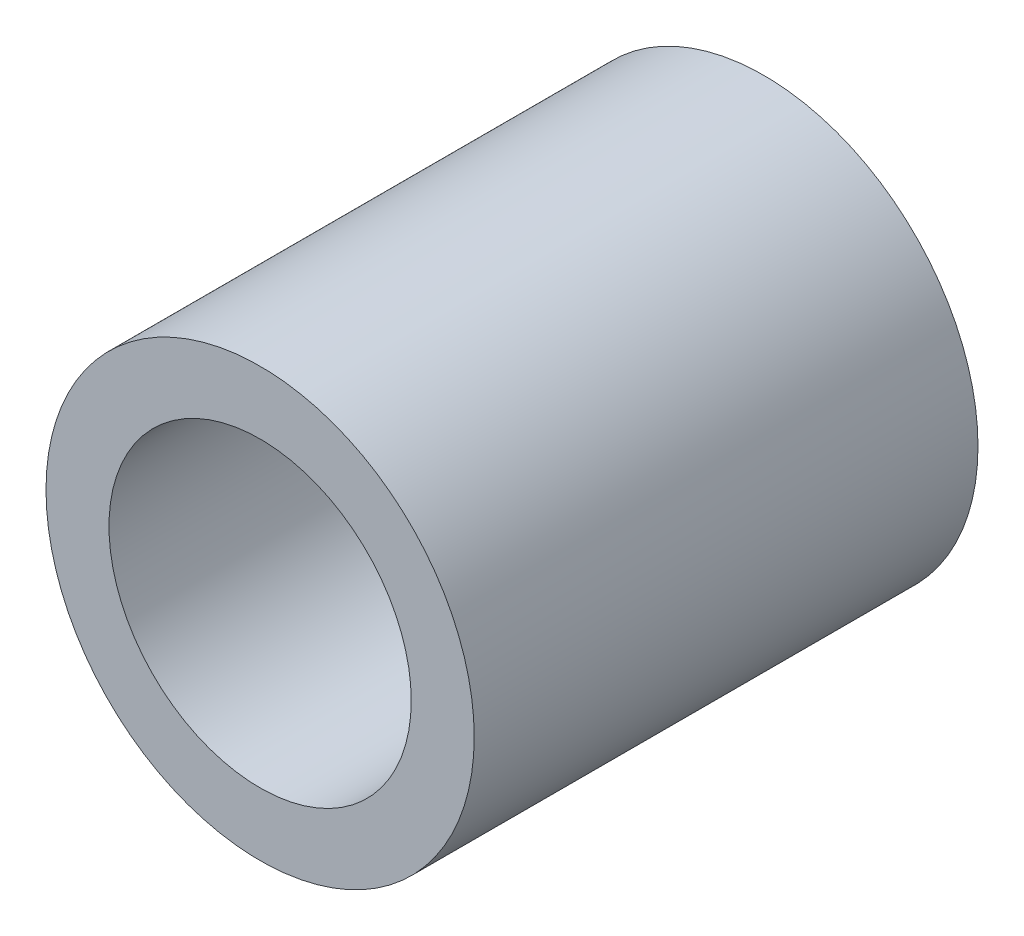
ISO-10303-21;
HEADER;
FILE_DESCRIPTION(('STEP AP214'),'2;1');
FILE_NAME('part.step','',(''),(''),'','','');
FILE_SCHEMA(('AUTOMOTIVE_DESIGN { 1 0 10303 214 1 1 1 1 }'));
ENDSEC;
DATA;
#1=APPLICATION_CONTEXT('core data for automotive mechanical design processes');
#2=APPLICATION_PROTOCOL_DEFINITION('international standard','automotive_design',2000,#1);
#3=PRODUCT_CONTEXT('',#1,'mechanical');
#4=PRODUCT('Part','Part','',(#3));
#5=PRODUCT_RELATED_PRODUCT_CATEGORY('part','',(#4));
#6=PRODUCT_DEFINITION_FORMATION('','',#4);
#7=PRODUCT_DEFINITION_CONTEXT('part definition',#1,'design');
#8=PRODUCT_DEFINITION('design','',#6,#7);
#9=PRODUCT_DEFINITION_SHAPE('','',#8);
#10=(LENGTH_UNIT() NAMED_UNIT(*) SI_UNIT(.MILLI.,.METRE.));
#11=(NAMED_UNIT(*) PLANE_ANGLE_UNIT() SI_UNIT($,.RADIAN.));
#12=(NAMED_UNIT(*) SI_UNIT($,.STERADIAN.) SOLID_ANGLE_UNIT());
#13=UNCERTAINTY_MEASURE_WITH_UNIT(LENGTH_MEASURE(1.E-05),#10,'distance_accuracy_value','');
#14=(GEOMETRIC_REPRESENTATION_CONTEXT(3) GLOBAL_UNCERTAINTY_ASSIGNED_CONTEXT((#13)) GLOBAL_UNIT_ASSIGNED_CONTEXT((#10,
#11,#12)) REPRESENTATION_CONTEXT('',''));
#15=CARTESIAN_POINT('',(0.,0.,0.));
#16=DIRECTION('',(0.,0.,1.));
#17=DIRECTION('',(1.,0.,0.));
#18=AXIS2_PLACEMENT_3D('',#15,#16,#17);
#19=CARTESIAN_POINT('',(0.,0.,25.4));
#20=DIRECTION('',(0.,0.,1.));
#21=DIRECTION('',(1.,0.,0.));
#22=AXIS2_PLACEMENT_3D('',#19,#20,#21);
#23=PLANE('',#22);
#24=CARTESIAN_POINT('',(0.,0.,25.4));
#25=DIRECTION('',(0.,0.,1.));
#26=DIRECTION('',(1.,0.,0.));
#27=AXIS2_PLACEMENT_3D('',#24,#25,#26);
#28=CIRCLE('',#27,10.795);
#29=CARTESIAN_POINT('',(10.795,0.,25.4));
#30=VERTEX_POINT('',#29);
#31=EDGE_CURVE('E10',#30,#30,#28,.T.);
#32=ORIENTED_EDGE('',*,*,#31,.T.);
#33=EDGE_LOOP('',(#32));
#34=FACE_BOUND('',#33,.T.);
#35=CARTESIAN_POINT('',(0.,0.,25.4));
#36=DIRECTION('',(0.,0.,1.));
#37=DIRECTION('',(1.,0.,0.));
#38=AXIS2_PLACEMENT_3D('',#35,#36,#37);
#39=CIRCLE('',#38,7.62);
#40=CARTESIAN_POINT('',(7.62,0.,25.4));
#41=VERTEX_POINT('',#40);
#42=EDGE_CURVE('E56',#41,#41,#39,.T.);
#43=ORIENTED_EDGE('',*,*,#42,.F.);
#44=EDGE_LOOP('',(#43));
#45=FACE_BOUND('',#44,.T.);
#46=ADVANCED_FACE('F43',(#34,#45),#23,.T.);
#47=CARTESIAN_POINT('',(0.,0.,0.));
#48=DIRECTION('',(0.,0.,1.));
#49=DIRECTION('',(1.,0.,0.));
#50=AXIS2_PLACEMENT_3D('',#47,#48,#49);
#51=PLANE('',#50);
#52=CARTESIAN_POINT('',(0.,0.,0.));
#53=DIRECTION('',(0.,0.,1.));
#54=DIRECTION('',(1.,0.,0.));
#55=AXIS2_PLACEMENT_3D('',#52,#53,#54);
#56=CIRCLE('',#55,10.795);
#57=CARTESIAN_POINT('',(10.795,0.,0.));
#58=VERTEX_POINT('',#57);
#59=EDGE_CURVE('E47',#58,#58,#56,.T.);
#60=ORIENTED_EDGE('',*,*,#59,.F.);
#61=EDGE_LOOP('',(#60));
#62=FACE_BOUND('',#61,.T.);
#63=CARTESIAN_POINT('',(0.,0.,0.));
#64=DIRECTION('',(0.,0.,1.));
#65=DIRECTION('',(1.,0.,0.));
#66=AXIS2_PLACEMENT_3D('',#63,#64,#65);
#67=CIRCLE('',#66,7.62);
#68=CARTESIAN_POINT('',(7.62,0.,0.));
#69=VERTEX_POINT('',#68);
#70=EDGE_CURVE('E58',#69,#69,#67,.T.);
#71=ORIENTED_EDGE('',*,*,#70,.T.);
#72=EDGE_LOOP('',(#71));
#73=FACE_BOUND('',#72,.T.);
#74=ADVANCED_FACE('F70',(#62,#73),#51,.F.);
#75=CARTESIAN_POINT('',(0.,0.,25.4));
#76=DIRECTION('',(0.,0.,-1.));
#77=DIRECTION('',(-1.,0.,0.));
#78=AXIS2_PLACEMENT_3D('',#75,#76,#77);
#79=CYLINDRICAL_SURFACE('',#78,10.795);
#80=ORIENTED_EDGE('',*,*,#31,.F.);
#81=EDGE_LOOP('',(#80));
#82=FACE_BOUND('',#81,.T.);
#83=ORIENTED_EDGE('',*,*,#59,.T.);
#84=EDGE_LOOP('',(#83));
#85=FACE_BOUND('',#84,.T.);
#86=ADVANCED_FACE('F45',(#82,#85),#79,.T.);
#87=CARTESIAN_POINT('',(0.,0.,25.4));
#88=DIRECTION('',(0.,0.,-1.));
#89=DIRECTION('',(-1.,0.,0.));
#90=AXIS2_PLACEMENT_3D('',#87,#88,#89);
#91=CYLINDRICAL_SURFACE('',#90,7.62);
#92=ORIENTED_EDGE('',*,*,#42,.T.);
#93=EDGE_LOOP('',(#92));
#94=FACE_BOUND('',#93,.T.);
#95=ORIENTED_EDGE('',*,*,#70,.F.);
#96=EDGE_LOOP('',(#95));
#97=FACE_BOUND('',#96,.T.);
#98=ADVANCED_FACE('F66',(#94,#97),#91,.F.);
#99=CLOSED_SHELL('',(#46,#74,#86,#98));
#100=MANIFOLD_SOLID_BREP('B2',#99);
#101=ADVANCED_BREP_SHAPE_REPRESENTATION('',(#18,#100),#14);
#102=SHAPE_DEFINITION_REPRESENTATION(#9,#101);
ENDSEC;
END-ISO-10303-21;
